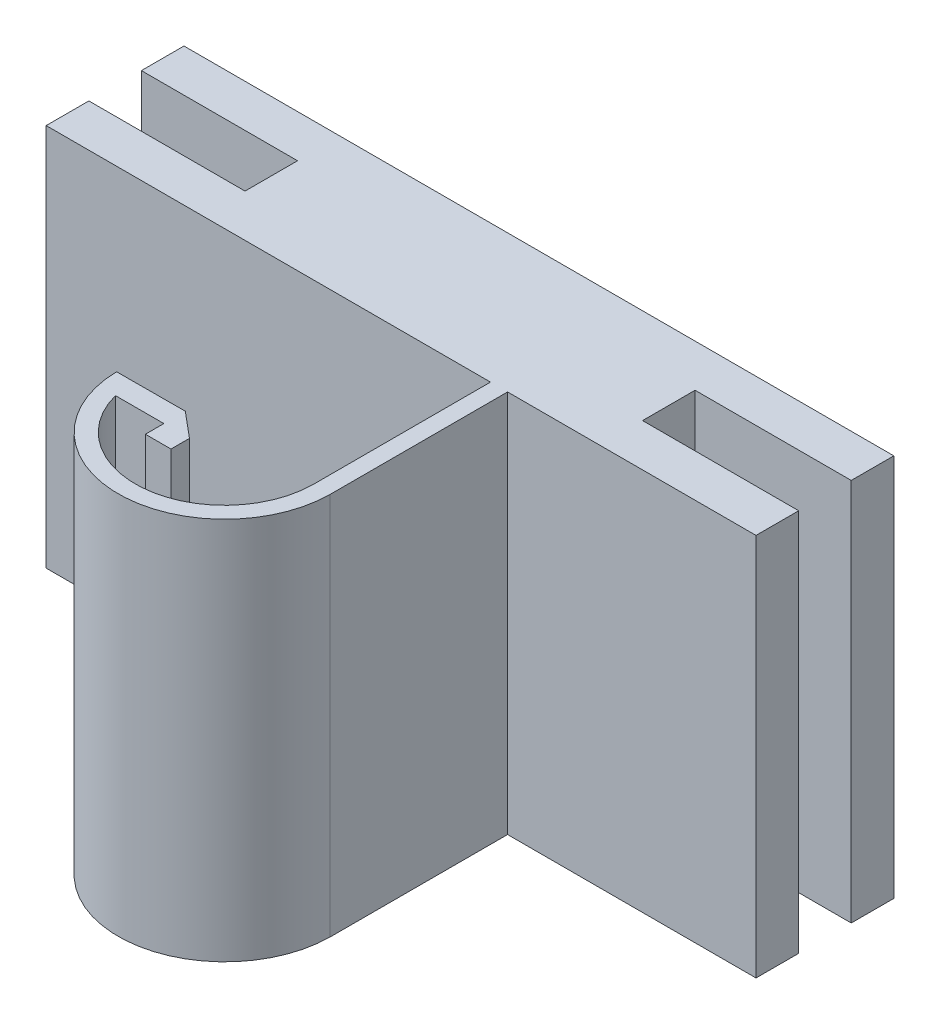
ISO-10303-21;
HEADER;
FILE_DESCRIPTION(('STEP AP214'),'2;1');
FILE_NAME('part.step','',(''),(''),'','','');
FILE_SCHEMA(('AUTOMOTIVE_DESIGN { 1 0 10303 214 1 1 1 1 }'));
ENDSEC;
DATA;
#1=APPLICATION_CONTEXT('core data for automotive mechanical design processes');
#2=APPLICATION_PROTOCOL_DEFINITION('international standard','automotive_design',2000,#1);
#3=PRODUCT_CONTEXT('',#1,'mechanical');
#4=PRODUCT('Part','Part','',(#3));
#5=PRODUCT_RELATED_PRODUCT_CATEGORY('part','',(#4));
#6=PRODUCT_DEFINITION_FORMATION('','',#4);
#7=PRODUCT_DEFINITION_CONTEXT('part definition',#1,'design');
#8=PRODUCT_DEFINITION('design','',#6,#7);
#9=PRODUCT_DEFINITION_SHAPE('','',#8);
#10=(LENGTH_UNIT() NAMED_UNIT(*) SI_UNIT(.MILLI.,.METRE.));
#11=(NAMED_UNIT(*) PLANE_ANGLE_UNIT() SI_UNIT($,.RADIAN.));
#12=(NAMED_UNIT(*) SI_UNIT($,.STERADIAN.) SOLID_ANGLE_UNIT());
#13=UNCERTAINTY_MEASURE_WITH_UNIT(LENGTH_MEASURE(1.E-05),#10,'distance_accuracy_value','');
#14=(GEOMETRIC_REPRESENTATION_CONTEXT(3) GLOBAL_UNCERTAINTY_ASSIGNED_CONTEXT((#13)) GLOBAL_UNIT_ASSIGNED_CONTEXT((#10,
#11,#12)) REPRESENTATION_CONTEXT('',''));
#15=CARTESIAN_POINT('',(0.,0.,0.));
#16=DIRECTION('',(0.,0.,1.));
#17=DIRECTION('',(1.,0.,0.));
#18=AXIS2_PLACEMENT_3D('',#15,#16,#17);
#19=CARTESIAN_POINT('',(-28.3494946045054,27.,-28.6641366865449));
#20=DIRECTION('',(1.,0.,0.));
#21=DIRECTION('',(0.,0.,-1.));
#22=AXIS2_PLACEMENT_3D('',#19,#20,#21);
#23=PLANE('',#22);
#24=DIRECTION('',(0.,0.,1.));
#25=VECTOR('',#24,1.);
#26=CARTESIAN_POINT('',(-28.3494946045054,0.,-28.6641366865449));
#27=LINE('',#26,#25);
#28=CARTESIAN_POINT('',(-28.3494946045054,0.,-28.6641366865449));
#29=VERTEX_POINT('',#28);
#30=CARTESIAN_POINT('',(-28.3494946045054,0.,-25.6641366865449));
#31=VERTEX_POINT('',#30);
#32=EDGE_CURVE('E219',#29,#31,#27,.T.);
#33=ORIENTED_EDGE('',*,*,#32,.T.);
#34=DIRECTION('',(0.,-1.,0.));
#35=VECTOR('',#34,1.);
#36=CARTESIAN_POINT('',(-28.3494946045054,27.,-25.6641366865449));
#37=LINE('',#36,#35);
#38=CARTESIAN_POINT('',(-28.3494946045054,27.,-25.6641366865449));
#39=VERTEX_POINT('',#38);
#40=EDGE_CURVE('E11',#39,#31,#37,.T.);
#41=ORIENTED_EDGE('',*,*,#40,.F.);
#42=DIRECTION('',(0.,0.,1.));
#43=VECTOR('',#42,1.);
#44=CARTESIAN_POINT('',(-28.3494946045054,27.,-28.6641366865449));
#45=LINE('',#44,#43);
#46=CARTESIAN_POINT('',(-28.3494946045054,27.,-28.6641366865449));
#47=VERTEX_POINT('',#46);
#48=EDGE_CURVE('E263',#47,#39,#45,.T.);
#49=ORIENTED_EDGE('',*,*,#48,.F.);
#50=DIRECTION('',(0.,-1.,0.));
#51=VECTOR('',#50,1.);
#52=CARTESIAN_POINT('',(-28.3494946045054,27.,-28.6641366865449));
#53=LINE('',#52,#51);
#54=EDGE_CURVE('E215',#47,#29,#53,.T.);
#55=ORIENTED_EDGE('',*,*,#54,.T.);
#56=EDGE_LOOP('',(#33,#41,#49,#55));
#57=FACE_BOUND('',#56,.T.);
#58=ADVANCED_FACE('F33',(#57),#23,.F.);
#59=CARTESIAN_POINT('',(-28.3494946045054,27.,-25.6641366865449));
#60=DIRECTION('',(0.,0.,-1.));
#61=DIRECTION('',(-1.,0.,0.));
#62=AXIS2_PLACEMENT_3D('',#59,#60,#61);
#63=PLANE('',#62);
#64=DIRECTION('',(1.,0.,0.));
#65=VECTOR('',#64,1.);
#66=CARTESIAN_POINT('',(-28.3494946045054,0.,-25.6641366865449));
#67=LINE('',#66,#65);
#68=CARTESIAN_POINT('',(-17.3494946045054,0.,-25.6641366865449));
#69=VERTEX_POINT('',#68);
#70=EDGE_CURVE('E222',#31,#69,#67,.T.);
#71=ORIENTED_EDGE('',*,*,#70,.T.);
#72=DIRECTION('',(0.,-1.,0.));
#73=VECTOR('',#72,1.);
#74=CARTESIAN_POINT('',(-17.3494946045054,27.,-25.6641366865449));
#75=LINE('',#74,#73);
#76=CARTESIAN_POINT('',(-17.3494946045054,27.,-25.6641366865449));
#77=VERTEX_POINT('',#76);
#78=EDGE_CURVE('E41',#77,#69,#75,.T.);
#79=ORIENTED_EDGE('',*,*,#78,.F.);
#80=DIRECTION('',(1.,0.,0.));
#81=VECTOR('',#80,1.);
#82=CARTESIAN_POINT('',(-28.3494946045054,27.,-25.6641366865449));
#83=LINE('',#82,#81);
#84=EDGE_CURVE('E137',#39,#77,#83,.T.);
#85=ORIENTED_EDGE('',*,*,#84,.F.);
#86=ORIENTED_EDGE('',*,*,#40,.T.);
#87=EDGE_LOOP('',(#71,#79,#85,#86));
#88=FACE_BOUND('',#87,.T.);
#89=ADVANCED_FACE('F396',(#88),#63,.F.);
#90=CARTESIAN_POINT('',(-17.3494946045054,27.,-25.6641366865449));
#91=DIRECTION('',(1.,0.,0.));
#92=DIRECTION('',(0.,0.,-1.));
#93=AXIS2_PLACEMENT_3D('',#90,#91,#92);
#94=PLANE('',#93);
#95=DIRECTION('',(0.,0.,1.));
#96=VECTOR('',#95,1.);
#97=CARTESIAN_POINT('',(-17.3494946045054,0.,-25.6641366865449));
#98=LINE('',#97,#96);
#99=CARTESIAN_POINT('',(-17.3494946045054,0.,-21.9641366865449));
#100=VERTEX_POINT('',#99);
#101=EDGE_CURVE('E224',#69,#100,#98,.T.);
#102=ORIENTED_EDGE('',*,*,#101,.T.);
#103=DIRECTION('',(0.,-1.,0.));
#104=VECTOR('',#103,1.);
#105=CARTESIAN_POINT('',(-17.3494946045054,27.,-21.9641366865449));
#106=LINE('',#105,#104);
#107=CARTESIAN_POINT('',(-17.3494946045054,27.,-21.9641366865449));
#108=VERTEX_POINT('',#107);
#109=EDGE_CURVE('E315',#108,#100,#106,.T.);
#110=ORIENTED_EDGE('',*,*,#109,.F.);
#111=DIRECTION('',(0.,0.,1.));
#112=VECTOR('',#111,1.);
#113=CARTESIAN_POINT('',(-17.3494946045054,27.,-25.6641366865449));
#114=LINE('',#113,#112);
#115=EDGE_CURVE('E323',#77,#108,#114,.T.);
#116=ORIENTED_EDGE('',*,*,#115,.F.);
#117=ORIENTED_EDGE('',*,*,#78,.T.);
#118=EDGE_LOOP('',(#102,#110,#116,#117));
#119=FACE_BOUND('',#118,.T.);
#120=ADVANCED_FACE('F321',(#119),#94,.F.);
#121=CARTESIAN_POINT('',(-28.3494946045054,27.,-21.9641366865449));
#122=DIRECTION('',(0.,0.,1.));
#123=DIRECTION('',(1.,0.,0.));
#124=AXIS2_PLACEMENT_3D('',#121,#122,#123);
#125=PLANE('',#124);
#126=DIRECTION('',(-1.,0.,0.));
#127=VECTOR('',#126,1.);
#128=CARTESIAN_POINT('',(-28.3494946045054,0.,-21.9641366865449));
#129=LINE('',#128,#127);
#130=CARTESIAN_POINT('',(-28.3494946045054,0.,-21.9641366865449));
#131=VERTEX_POINT('',#130);
#132=EDGE_CURVE('E226',#100,#131,#129,.T.);
#133=ORIENTED_EDGE('',*,*,#132,.T.);
#134=DIRECTION('',(0.,-1.,0.));
#135=VECTOR('',#134,1.);
#136=CARTESIAN_POINT('',(-28.3494946045054,27.,-21.9641366865449));
#137=LINE('',#136,#135);
#138=CARTESIAN_POINT('',(-28.3494946045054,27.,-21.9641366865449));
#139=VERTEX_POINT('',#138);
#140=EDGE_CURVE('E312',#139,#131,#137,.T.);
#141=ORIENTED_EDGE('',*,*,#140,.F.);
#142=DIRECTION('',(-1.,0.,0.));
#143=VECTOR('',#142,1.);
#144=CARTESIAN_POINT('',(-28.3494946045054,27.,-21.9641366865449));
#145=LINE('',#144,#143);
#146=EDGE_CURVE('E341',#108,#139,#145,.T.);
#147=ORIENTED_EDGE('',*,*,#146,.F.);
#148=ORIENTED_EDGE('',*,*,#109,.T.);
#149=EDGE_LOOP('',(#133,#141,#147,#148));
#150=FACE_BOUND('',#149,.T.);
#151=ADVANCED_FACE('F332',(#150),#125,.F.);
#152=CARTESIAN_POINT('',(-28.3494946045054,27.,-21.9641366865449));
#153=DIRECTION('',(1.,0.,0.));
#154=DIRECTION('',(0.,0.,-1.));
#155=AXIS2_PLACEMENT_3D('',#152,#153,#154);
#156=PLANE('',#155);
#157=DIRECTION('',(0.,0.,1.));
#158=VECTOR('',#157,1.);
#159=CARTESIAN_POINT('',(-28.3494946045054,0.,-21.9641366865449));
#160=LINE('',#159,#158);
#161=CARTESIAN_POINT('',(-28.3494946045054,0.,-18.957031621231));
#162=VERTEX_POINT('',#161);
#163=EDGE_CURVE('E228',#131,#162,#160,.T.);
#164=ORIENTED_EDGE('',*,*,#163,.T.);
#165=DIRECTION('',(0.,-1.,0.));
#166=VECTOR('',#165,1.);
#167=CARTESIAN_POINT('',(-28.3494946045054,27.,-18.957031621231));
#168=LINE('',#167,#166);
#169=CARTESIAN_POINT('',(-28.3494946045054,27.,-18.957031621231));
#170=VERTEX_POINT('',#169);
#171=EDGE_CURVE('E309',#170,#162,#168,.T.);
#172=ORIENTED_EDGE('',*,*,#171,.F.);
#173=DIRECTION('',(0.,0.,1.));
#174=VECTOR('',#173,1.);
#175=CARTESIAN_POINT('',(-28.3494946045054,27.,-21.9641366865449));
#176=LINE('',#175,#174);
#177=EDGE_CURVE('E338',#139,#170,#176,.T.);
#178=ORIENTED_EDGE('',*,*,#177,.F.);
#179=ORIENTED_EDGE('',*,*,#140,.T.);
#180=EDGE_LOOP('',(#164,#172,#178,#179));
#181=FACE_BOUND('',#180,.T.);
#182=ADVANCED_FACE('F336',(#181),#156,.F.);
#183=CARTESIAN_POINT('',(-28.3494946045054,27.,-18.957031621231));
#184=DIRECTION('',(0.,0.,-1.));
#185=DIRECTION('',(-1.,0.,0.));
#186=AXIS2_PLACEMENT_3D('',#183,#184,#185);
#187=PLANE('',#186);
#188=DIRECTION('',(1.,0.,0.));
#189=VECTOR('',#188,1.);
#190=CARTESIAN_POINT('',(-28.3494946045054,0.,-18.957031621231));
#191=LINE('',#190,#189);
#192=CARTESIAN_POINT('',(2.94781302884944,0.,-18.957031621231));
#193=VERTEX_POINT('',#192);
#194=EDGE_CURVE('E230',#162,#193,#191,.T.);
#195=ORIENTED_EDGE('',*,*,#194,.T.);
#196=DIRECTION('',(0.,-1.,0.));
#197=VECTOR('',#196,1.);
#198=CARTESIAN_POINT('',(2.94781302884944,27.,-18.957031621231));
#199=LINE('',#198,#197);
#200=CARTESIAN_POINT('',(2.94781302884944,27.,-18.957031621231));
#201=VERTEX_POINT('',#200);
#202=EDGE_CURVE('E306',#201,#193,#199,.T.);
#203=ORIENTED_EDGE('',*,*,#202,.F.);
#204=DIRECTION('',(1.,0.,0.));
#205=VECTOR('',#204,1.);
#206=CARTESIAN_POINT('',(-28.3494946045054,27.,-18.957031621231));
#207=LINE('',#206,#205);
#208=EDGE_CURVE('E340',#170,#201,#207,.T.);
#209=ORIENTED_EDGE('',*,*,#208,.F.);
#210=ORIENTED_EDGE('',*,*,#171,.T.);
#211=EDGE_LOOP('',(#195,#203,#209,#210));
#212=FACE_BOUND('',#211,.T.);
#213=ADVANCED_FACE('F409',(#212),#187,.F.);
#214=CARTESIAN_POINT('',(2.94781302884944,27.,-6.44073955662851));
#215=DIRECTION('',(1.,0.,0.));
#216=DIRECTION('',(0.,0.,-1.));
#217=AXIS2_PLACEMENT_3D('',#214,#215,#216);
#218=PLANE('',#217);
#219=DIRECTION('',(0.,0.,1.));
#220=VECTOR('',#219,1.);
#221=CARTESIAN_POINT('',(2.94781302884944,0.,-6.44073955662851));
#222=LINE('',#221,#220);
#223=CARTESIAN_POINT('',(2.94781302884944,0.,-6.44073955662851));
#224=VERTEX_POINT('',#223);
#225=EDGE_CURVE('E232',#193,#224,#222,.T.);
#226=ORIENTED_EDGE('',*,*,#225,.T.);
#227=DIRECTION('',(0.,-1.,0.));
#228=VECTOR('',#227,1.);
#229=CARTESIAN_POINT('',(2.94781302884944,27.,-6.44073955662851));
#230=LINE('',#229,#228);
#231=CARTESIAN_POINT('',(2.94781302884944,27.,-6.44073955662851));
#232=VERTEX_POINT('',#231);
#233=EDGE_CURVE('E303',#232,#224,#230,.T.);
#234=ORIENTED_EDGE('',*,*,#233,.F.);
#235=DIRECTION('',(0.,0.,1.));
#236=VECTOR('',#235,1.);
#237=CARTESIAN_POINT('',(2.94781302884944,27.,-6.44073955662851));
#238=LINE('',#237,#236);
#239=EDGE_CURVE('E343',#201,#232,#238,.T.);
#240=ORIENTED_EDGE('',*,*,#239,.F.);
#241=ORIENTED_EDGE('',*,*,#202,.T.);
#242=EDGE_LOOP('',(#226,#234,#240,#241));
#243=FACE_BOUND('',#242,.T.);
#244=ADVANCED_FACE('F412',(#243),#218,.F.);
#245=CARTESIAN_POINT('',(-3.34884776816842,27.,-6.52915678023728));
#246=DIRECTION('',(0.,-1.,0.));
#247=DIRECTION('',(0.,0.,-1.));
#248=AXIS2_PLACEMENT_3D('',#245,#246,#247);
#249=CYLINDRICAL_SURFACE('',#248,6.29728154032613);
#250=CARTESIAN_POINT('',(-3.34884776816842,0.,-6.52915678023728));
#251=DIRECTION('',(0.,-1.,0.));
#252=DIRECTION('',(0.,0.,1.));
#253=AXIS2_PLACEMENT_3D('',#250,#251,#252);
#254=CIRCLE('',#253,6.29728154032613);
#255=CARTESIAN_POINT('',(-9.43791517748593,0.,-4.9232262453387));
#256=VERTEX_POINT('',#255);
#257=EDGE_CURVE('E234',#224,#256,#254,.T.);
#258=ORIENTED_EDGE('',*,*,#257,.T.);
#259=DIRECTION('',(0.,-1.,0.));
#260=VECTOR('',#259,1.);
#261=CARTESIAN_POINT('',(-9.43791517748593,27.,-4.9232262453387));
#262=LINE('',#261,#260);
#263=CARTESIAN_POINT('',(-9.43791517748593,27.,-4.9232262453387));
#264=VERTEX_POINT('',#263);
#265=EDGE_CURVE('E300',#264,#256,#262,.T.);
#266=ORIENTED_EDGE('',*,*,#265,.F.);
#267=CARTESIAN_POINT('',(-3.34884776816842,27.,-6.52915678023728));
#268=DIRECTION('',(0.,-1.,0.));
#269=DIRECTION('',(0.,0.,1.));
#270=AXIS2_PLACEMENT_3D('',#267,#268,#269);
#271=CIRCLE('',#270,6.29728154032613);
#272=EDGE_CURVE('E349',#232,#264,#271,.T.);
#273=ORIENTED_EDGE('',*,*,#272,.F.);
#274=ORIENTED_EDGE('',*,*,#233,.T.);
#275=EDGE_LOOP('',(#258,#266,#273,#274));
#276=FACE_BOUND('',#275,.T.);
#277=ADVANCED_FACE('F416',(#276),#249,.F.);
#278=CARTESIAN_POINT('',(-6.02618083831885,27.,-4.9232262453387));
#279=DIRECTION('',(0.,0.,-1.));
#280=DIRECTION('',(-1.,0.,0.));
#281=AXIS2_PLACEMENT_3D('',#278,#279,#280);
#282=PLANE('',#281);
#283=DIRECTION('',(1.,0.,0.));
#284=VECTOR('',#283,1.);
#285=CARTESIAN_POINT('',(-6.02618083831885,0.,-4.9232262453387));
#286=LINE('',#285,#284);
#287=CARTESIAN_POINT('',(-6.02618083831885,0.,-4.9232262453387));
#288=VERTEX_POINT('',#287);
#289=EDGE_CURVE('E236',#256,#288,#286,.T.);
#290=ORIENTED_EDGE('',*,*,#289,.T.);
#291=DIRECTION('',(0.,-1.,0.));
#292=VECTOR('',#291,1.);
#293=CARTESIAN_POINT('',(-6.02618083831885,27.,-4.9232262453387));
#294=LINE('',#293,#292);
#295=CARTESIAN_POINT('',(-6.02618083831885,27.,-4.9232262453387));
#296=VERTEX_POINT('',#295);
#297=EDGE_CURVE('E297',#296,#288,#294,.T.);
#298=ORIENTED_EDGE('',*,*,#297,.F.);
#299=DIRECTION('',(1.,0.,0.));
#300=VECTOR('',#299,1.);
#301=CARTESIAN_POINT('',(-6.02618083831885,27.,-4.9232262453387));
#302=LINE('',#301,#300);
#303=EDGE_CURVE('E351',#264,#296,#302,.T.);
#304=ORIENTED_EDGE('',*,*,#303,.F.);
#305=ORIENTED_EDGE('',*,*,#265,.T.);
#306=EDGE_LOOP('',(#290,#298,#304,#305));
#307=FACE_BOUND('',#306,.T.);
#308=ADVANCED_FACE('F420',(#307),#282,.F.);
#309=CARTESIAN_POINT('',(-6.02618083831885,27.,-3.62215741536431));
#310=DIRECTION('',(1.,0.,0.));
#311=DIRECTION('',(0.,0.,-1.));
#312=AXIS2_PLACEMENT_3D('',#309,#310,#311);
#313=PLANE('',#312);
#314=DIRECTION('',(0.,0.,1.));
#315=VECTOR('',#314,1.);
#316=CARTESIAN_POINT('',(-6.02618083831885,0.,-3.62215741536431));
#317=LINE('',#316,#315);
#318=CARTESIAN_POINT('',(-6.02618083831885,0.,-3.62215741536431));
#319=VERTEX_POINT('',#318);
#320=EDGE_CURVE('E238',#288,#319,#317,.T.);
#321=ORIENTED_EDGE('',*,*,#320,.T.);
#322=DIRECTION('',(0.,-1.,0.));
#323=VECTOR('',#322,1.);
#324=CARTESIAN_POINT('',(-6.02618083831885,27.,-3.62215741536431));
#325=LINE('',#324,#323);
#326=CARTESIAN_POINT('',(-6.02618083831885,27.,-3.62215741536431));
#327=VERTEX_POINT('',#326);
#328=EDGE_CURVE('E294',#327,#319,#325,.T.);
#329=ORIENTED_EDGE('',*,*,#328,.F.);
#330=DIRECTION('',(0.,0.,1.));
#331=VECTOR('',#330,1.);
#332=CARTESIAN_POINT('',(-6.02618083831885,27.,-3.62215741536431));
#333=LINE('',#332,#331);
#334=EDGE_CURVE('E353',#296,#327,#333,.T.);
#335=ORIENTED_EDGE('',*,*,#334,.F.);
#336=ORIENTED_EDGE('',*,*,#297,.T.);
#337=EDGE_LOOP('',(#321,#329,#335,#336));
#338=FACE_BOUND('',#337,.T.);
#339=ADVANCED_FACE('F424',(#338),#313,.F.);
#340=CARTESIAN_POINT('',(-4.22249353495374,27.,-3.62215741536431));
#341=DIRECTION('',(0.,0.,-1.));
#342=DIRECTION('',(-1.,0.,0.));
#343=AXIS2_PLACEMENT_3D('',#340,#341,#342);
#344=PLANE('',#343);
#345=DIRECTION('',(1.,0.,0.));
#346=VECTOR('',#345,1.);
#347=CARTESIAN_POINT('',(-4.22249353495374,0.,-3.62215741536431));
#348=LINE('',#347,#346);
#349=CARTESIAN_POINT('',(-4.22249353495374,0.,-3.62215741536431));
#350=VERTEX_POINT('',#349);
#351=EDGE_CURVE('E240',#319,#350,#348,.T.);
#352=ORIENTED_EDGE('',*,*,#351,.T.);
#353=DIRECTION('',(0.,-1.,0.));
#354=VECTOR('',#353,1.);
#355=CARTESIAN_POINT('',(-4.22249353495374,27.,-3.62215741536431));
#356=LINE('',#355,#354);
#357=CARTESIAN_POINT('',(-4.22249353495374,27.,-3.62215741536431));
#358=VERTEX_POINT('',#357);
#359=EDGE_CURVE('E291',#358,#350,#356,.T.);
#360=ORIENTED_EDGE('',*,*,#359,.F.);
#361=DIRECTION('',(1.,0.,0.));
#362=VECTOR('',#361,1.);
#363=CARTESIAN_POINT('',(-4.22249353495374,27.,-3.62215741536431));
#364=LINE('',#363,#362);
#365=EDGE_CURVE('E355',#327,#358,#364,.T.);
#366=ORIENTED_EDGE('',*,*,#365,.F.);
#367=ORIENTED_EDGE('',*,*,#328,.T.);
#368=EDGE_LOOP('',(#352,#360,#366,#367));
#369=FACE_BOUND('',#368,.T.);
#370=ADVANCED_FACE('F428',(#369),#344,.F.);
#371=CARTESIAN_POINT('',(-4.22249353495374,27.,-4.9232262453387));
#372=DIRECTION('',(-1.,0.,0.));
#373=DIRECTION('',(0.,0.,1.));
#374=AXIS2_PLACEMENT_3D('',#371,#372,#373);
#375=PLANE('',#374);
#376=DIRECTION('',(0.,0.,-1.));
#377=VECTOR('',#376,1.);
#378=CARTESIAN_POINT('',(-4.22249353495374,0.,-4.9232262453387));
#379=LINE('',#378,#377);
#380=CARTESIAN_POINT('',(-4.22249353495374,0.,-4.9232262453387));
#381=VERTEX_POINT('',#380);
#382=EDGE_CURVE('E242',#350,#381,#379,.T.);
#383=ORIENTED_EDGE('',*,*,#382,.T.);
#384=DIRECTION('',(0.,-1.,0.));
#385=VECTOR('',#384,1.);
#386=CARTESIAN_POINT('',(-4.22249353495374,27.,-4.9232262453387));
#387=LINE('',#386,#385);
#388=CARTESIAN_POINT('',(-4.22249353495374,27.,-4.9232262453387));
#389=VERTEX_POINT('',#388);
#390=EDGE_CURVE('E288',#389,#381,#387,.T.);
#391=ORIENTED_EDGE('',*,*,#390,.F.);
#392=DIRECTION('',(0.,0.,-1.));
#393=VECTOR('',#392,1.);
#394=CARTESIAN_POINT('',(-4.22249353495374,27.,-4.9232262453387));
#395=LINE('',#394,#393);
#396=EDGE_CURVE('E357',#358,#389,#395,.T.);
#397=ORIENTED_EDGE('',*,*,#396,.F.);
#398=ORIENTED_EDGE('',*,*,#359,.T.);
#399=EDGE_LOOP('',(#383,#391,#397,#398));
#400=FACE_BOUND('',#399,.T.);
#401=ADVANCED_FACE('F432',(#400),#375,.F.);
#402=CARTESIAN_POINT('',(-6.02618083831885,27.,-6.43238928070324));
#403=DIRECTION('',(-0.641711450833544,0.,0.766946160997699));
#404=DIRECTION('',(0.766946160997698,0.,0.641711450833544));
#405=AXIS2_PLACEMENT_3D('',#402,#403,#404);
#406=PLANE('',#405);
#407=DIRECTION('',(-0.766946160997698,0.,-0.641711450833544));
#408=VECTOR('',#407,1.);
#409=CARTESIAN_POINT('',(-6.02618083831885,0.,-6.43238928070324));
#410=LINE('',#409,#408);
#411=CARTESIAN_POINT('',(-6.02618083831885,0.,-6.43238928070324));
#412=VERTEX_POINT('',#411);
#413=EDGE_CURVE('E244',#381,#412,#410,.T.);
#414=ORIENTED_EDGE('',*,*,#413,.T.);
#415=DIRECTION('',(0.,-1.,0.));
#416=VECTOR('',#415,1.);
#417=CARTESIAN_POINT('',(-6.02618083831885,27.,-6.43238928070324));
#418=LINE('',#417,#416);
#419=CARTESIAN_POINT('',(-6.02618083831885,27.,-6.43238928070324));
#420=VERTEX_POINT('',#419);
#421=EDGE_CURVE('E285',#420,#412,#418,.T.);
#422=ORIENTED_EDGE('',*,*,#421,.F.);
#423=DIRECTION('',(-0.766946160997698,0.,-0.641711450833544));
#424=VECTOR('',#423,1.);
#425=CARTESIAN_POINT('',(-6.02618083831885,27.,-6.43238928070324));
#426=LINE('',#425,#424);
#427=EDGE_CURVE('E359',#389,#420,#426,.T.);
#428=ORIENTED_EDGE('',*,*,#427,.F.);
#429=ORIENTED_EDGE('',*,*,#390,.T.);
#430=EDGE_LOOP('',(#414,#422,#428,#429));
#431=FACE_BOUND('',#430,.T.);
#432=ADVANCED_FACE('F436',(#431),#406,.F.);
#433=CARTESIAN_POINT('',(-10.8477142626421,27.,-6.41734797036781));
#434=DIRECTION('',(0.0031195961577817,0.,0.999995134048068));
#435=DIRECTION('',(0.999995134048068,0.,-0.0031195961577817));
#436=AXIS2_PLACEMENT_3D('',#433,#434,#435);
#437=PLANE('',#436);
#438=DIRECTION('',(-0.999995134048067,0.,0.0031195961577817));
#439=VECTOR('',#438,1.);
#440=CARTESIAN_POINT('',(-10.8477142626421,0.,-6.41734797036781));
#441=LINE('',#440,#439);
#442=CARTESIAN_POINT('',(-10.8477142626421,0.,-6.41734797036781));
#443=VERTEX_POINT('',#442);
#444=EDGE_CURVE('E246',#412,#443,#441,.T.);
#445=ORIENTED_EDGE('',*,*,#444,.T.);
#446=DIRECTION('',(0.,-1.,0.));
#447=VECTOR('',#446,1.);
#448=CARTESIAN_POINT('',(-10.8477142626421,27.,-6.41734797036781));
#449=LINE('',#448,#447);
#450=CARTESIAN_POINT('',(-10.8477142626421,27.,-6.41734797036781));
#451=VERTEX_POINT('',#450);
#452=EDGE_CURVE('E282',#451,#443,#449,.T.);
#453=ORIENTED_EDGE('',*,*,#452,.F.);
#454=DIRECTION('',(-0.999995134048067,0.,0.0031195961577817));
#455=VECTOR('',#454,1.);
#456=CARTESIAN_POINT('',(-10.8477142626421,27.,-6.41734797036781));
#457=LINE('',#456,#455);
#458=EDGE_CURVE('E361',#420,#451,#457,.T.);
#459=ORIENTED_EDGE('',*,*,#458,.F.);
#460=ORIENTED_EDGE('',*,*,#421,.T.);
#461=EDGE_LOOP('',(#445,#453,#459,#460));
#462=FACE_BOUND('',#461,.T.);
#463=ADVANCED_FACE('F440',(#462),#437,.F.);
#464=CARTESIAN_POINT('',(-3.34884776816842,27.,-6.52915678023728));
#465=DIRECTION('',(0.,-1.,0.));
#466=DIRECTION('',(0.,0.,-1.));
#467=AXIS2_PLACEMENT_3D('',#464,#465,#466);
#468=CYLINDRICAL_SURFACE('',#467,7.49969998812645);
#469=CARTESIAN_POINT('',(-3.34884776816842,0.,-6.52915678023728));
#470=DIRECTION('',(0.,1.,0.));
#471=DIRECTION('',(0.,0.,1.));
#472=AXIS2_PLACEMENT_3D('',#469,#470,#471);
#473=CIRCLE('',#472,7.49969998812645);
#474=CARTESIAN_POINT('',(4.15050539549457,0.,-6.45703162123102));
#475=VERTEX_POINT('',#474);
#476=EDGE_CURVE('E248',#443,#475,#473,.T.);
#477=ORIENTED_EDGE('',*,*,#476,.T.);
#478=DIRECTION('',(0.,-1.,0.));
#479=VECTOR('',#478,1.);
#480=CARTESIAN_POINT('',(4.15050539549457,27.,-6.45703162123102));
#481=LINE('',#480,#479);
#482=CARTESIAN_POINT('',(4.15050539549457,27.,-6.45703162123102));
#483=VERTEX_POINT('',#482);
#484=EDGE_CURVE('E279',#483,#475,#481,.T.);
#485=ORIENTED_EDGE('',*,*,#484,.F.);
#486=CARTESIAN_POINT('',(-3.34884776816842,27.,-6.52915678023728));
#487=DIRECTION('',(0.,1.,0.));
#488=DIRECTION('',(0.,0.,1.));
#489=AXIS2_PLACEMENT_3D('',#486,#487,#488);
#490=CIRCLE('',#489,7.49969998812645);
#491=EDGE_CURVE('E363',#451,#483,#490,.T.);
#492=ORIENTED_EDGE('',*,*,#491,.F.);
#493=ORIENTED_EDGE('',*,*,#452,.T.);
#494=EDGE_LOOP('',(#477,#485,#492,#493));
#495=FACE_BOUND('',#494,.T.);
#496=ADVANCED_FACE('F444',(#495),#468,.T.);
#497=CARTESIAN_POINT('',(4.15050539549457,27.,-18.957031621231));
#498=DIRECTION('',(-1.,0.,0.));
#499=DIRECTION('',(0.,0.,1.));
#500=AXIS2_PLACEMENT_3D('',#497,#498,#499);
#501=PLANE('',#500);
#502=DIRECTION('',(0.,0.,-1.));
#503=VECTOR('',#502,1.);
#504=CARTESIAN_POINT('',(4.15050539549457,0.,-18.957031621231));
#505=LINE('',#504,#503);
#506=CARTESIAN_POINT('',(4.15050539549457,0.,-18.957031621231));
#507=VERTEX_POINT('',#506);
#508=EDGE_CURVE('E250',#475,#507,#505,.T.);
#509=ORIENTED_EDGE('',*,*,#508,.T.);
#510=DIRECTION('',(0.,-1.,0.));
#511=VECTOR('',#510,1.);
#512=CARTESIAN_POINT('',(4.15050539549457,27.,-18.957031621231));
#513=LINE('',#512,#511);
#514=CARTESIAN_POINT('',(4.15050539549457,27.,-18.957031621231));
#515=VERTEX_POINT('',#514);
#516=EDGE_CURVE('E276',#515,#507,#513,.T.);
#517=ORIENTED_EDGE('',*,*,#516,.F.);
#518=DIRECTION('',(0.,0.,-1.));
#519=VECTOR('',#518,1.);
#520=CARTESIAN_POINT('',(4.15050539549457,27.,-18.957031621231));
#521=LINE('',#520,#519);
#522=EDGE_CURVE('E365',#483,#515,#521,.T.);
#523=ORIENTED_EDGE('',*,*,#522,.F.);
#524=ORIENTED_EDGE('',*,*,#484,.T.);
#525=EDGE_LOOP('',(#509,#517,#523,#524));
#526=FACE_BOUND('',#525,.T.);
#527=ADVANCED_FACE('F448',(#526),#501,.F.);
#528=CARTESIAN_POINT('',(4.15050539549457,27.,-18.957031621231));
#529=DIRECTION('',(0.,0.,-1.));
#530=DIRECTION('',(-1.,0.,0.));
#531=AXIS2_PLACEMENT_3D('',#528,#529,#530);
#532=PLANE('',#531);
#533=DIRECTION('',(1.,0.,0.));
#534=VECTOR('',#533,1.);
#535=CARTESIAN_POINT('',(4.15050539549457,0.,-18.957031621231));
#536=LINE('',#535,#534);
#537=CARTESIAN_POINT('',(21.6505053954946,0.,-18.957031621231));
#538=VERTEX_POINT('',#537);
#539=EDGE_CURVE('E252',#507,#538,#536,.T.);
#540=ORIENTED_EDGE('',*,*,#539,.T.);
#541=DIRECTION('',(0.,-1.,0.));
#542=VECTOR('',#541,1.);
#543=CARTESIAN_POINT('',(21.6505053954946,27.,-18.957031621231));
#544=LINE('',#543,#542);
#545=CARTESIAN_POINT('',(21.6505053954946,27.,-18.957031621231));
#546=VERTEX_POINT('',#545);
#547=EDGE_CURVE('E273',#546,#538,#544,.T.);
#548=ORIENTED_EDGE('',*,*,#547,.F.);
#549=DIRECTION('',(1.,0.,0.));
#550=VECTOR('',#549,1.);
#551=CARTESIAN_POINT('',(4.15050539549457,27.,-18.957031621231));
#552=LINE('',#551,#550);
#553=EDGE_CURVE('E367',#515,#546,#552,.T.);
#554=ORIENTED_EDGE('',*,*,#553,.F.);
#555=ORIENTED_EDGE('',*,*,#516,.T.);
#556=EDGE_LOOP('',(#540,#548,#554,#555));
#557=FACE_BOUND('',#556,.T.);
#558=ADVANCED_FACE('F452',(#557),#532,.F.);
#559=CARTESIAN_POINT('',(21.6505053954946,27.,-21.9641366865449));
#560=DIRECTION('',(-1.,0.,0.));
#561=DIRECTION('',(0.,0.,1.));
#562=AXIS2_PLACEMENT_3D('',#559,#560,#561);
#563=PLANE('',#562);
#564=DIRECTION('',(0.,0.,-1.));
#565=VECTOR('',#564,1.);
#566=CARTESIAN_POINT('',(21.6505053954946,0.,-21.9641366865449));
#567=LINE('',#566,#565);
#568=CARTESIAN_POINT('',(21.6505053954946,0.,-21.9641366865449));
#569=VERTEX_POINT('',#568);
#570=EDGE_CURVE('E254',#538,#569,#567,.T.);
#571=ORIENTED_EDGE('',*,*,#570,.T.);
#572=DIRECTION('',(0.,-1.,0.));
#573=VECTOR('',#572,1.);
#574=CARTESIAN_POINT('',(21.6505053954946,27.,-21.9641366865449));
#575=LINE('',#574,#573);
#576=CARTESIAN_POINT('',(21.6505053954946,27.,-21.9641366865449));
#577=VERTEX_POINT('',#576);
#578=EDGE_CURVE('E270',#577,#569,#575,.T.);
#579=ORIENTED_EDGE('',*,*,#578,.F.);
#580=DIRECTION('',(0.,0.,-1.));
#581=VECTOR('',#580,1.);
#582=CARTESIAN_POINT('',(21.6505053954946,27.,-21.9641366865449));
#583=LINE('',#582,#581);
#584=EDGE_CURVE('E369',#546,#577,#583,.T.);
#585=ORIENTED_EDGE('',*,*,#584,.F.);
#586=ORIENTED_EDGE('',*,*,#547,.T.);
#587=EDGE_LOOP('',(#571,#579,#585,#586));
#588=FACE_BOUND('',#587,.T.);
#589=ADVANCED_FACE('F456',(#588),#563,.F.);
#590=CARTESIAN_POINT('',(10.6505053954946,27.,-21.9641366865449));
#591=DIRECTION('',(0.,0.,1.));
#592=DIRECTION('',(1.,0.,0.));
#593=AXIS2_PLACEMENT_3D('',#590,#591,#592);
#594=PLANE('',#593);
#595=DIRECTION('',(-1.,0.,0.));
#596=VECTOR('',#595,1.);
#597=CARTESIAN_POINT('',(10.6505053954946,0.,-21.9641366865449));
#598=LINE('',#597,#596);
#599=CARTESIAN_POINT('',(10.6505053954946,0.,-21.9641366865449));
#600=VERTEX_POINT('',#599);
#601=EDGE_CURVE('E256',#569,#600,#598,.T.);
#602=ORIENTED_EDGE('',*,*,#601,.T.);
#603=DIRECTION('',(0.,-1.,0.));
#604=VECTOR('',#603,1.);
#605=CARTESIAN_POINT('',(10.6505053954946,27.,-21.9641366865449));
#606=LINE('',#605,#604);
#607=CARTESIAN_POINT('',(10.6505053954946,27.,-21.9641366865449));
#608=VERTEX_POINT('',#607);
#609=EDGE_CURVE('E267',#608,#600,#606,.T.);
#610=ORIENTED_EDGE('',*,*,#609,.F.);
#611=DIRECTION('',(-1.,0.,0.));
#612=VECTOR('',#611,1.);
#613=CARTESIAN_POINT('',(10.6505053954946,27.,-21.9641366865449));
#614=LINE('',#613,#612);
#615=EDGE_CURVE('E371',#577,#608,#614,.T.);
#616=ORIENTED_EDGE('',*,*,#615,.F.);
#617=ORIENTED_EDGE('',*,*,#578,.T.);
#618=EDGE_LOOP('',(#602,#610,#616,#617));
#619=FACE_BOUND('',#618,.T.);
#620=ADVANCED_FACE('F377',(#619),#594,.F.);
#621=CARTESIAN_POINT('',(10.6505053954946,27.,-25.6641366865449));
#622=DIRECTION('',(-1.,0.,0.));
#623=DIRECTION('',(0.,0.,1.));
#624=AXIS2_PLACEMENT_3D('',#621,#622,#623);
#625=PLANE('',#624);
#626=DIRECTION('',(0.,0.,-1.));
#627=VECTOR('',#626,1.);
#628=CARTESIAN_POINT('',(10.6505053954946,0.,-25.6641366865449));
#629=LINE('',#628,#627);
#630=CARTESIAN_POINT('',(10.6505053954946,0.,-25.6641366865449));
#631=VERTEX_POINT('',#630);
#632=EDGE_CURVE('E258',#600,#631,#629,.T.);
#633=ORIENTED_EDGE('',*,*,#632,.T.);
#634=DIRECTION('',(0.,-1.,0.));
#635=VECTOR('',#634,1.);
#636=CARTESIAN_POINT('',(10.6505053954946,27.,-25.6641366865449));
#637=LINE('',#636,#635);
#638=CARTESIAN_POINT('',(10.6505053954946,27.,-25.6641366865449));
#639=VERTEX_POINT('',#638);
#640=EDGE_CURVE('E210',#639,#631,#637,.T.);
#641=ORIENTED_EDGE('',*,*,#640,.F.);
#642=DIRECTION('',(0.,0.,-1.));
#643=VECTOR('',#642,1.);
#644=CARTESIAN_POINT('',(10.6505053954946,27.,-25.6641366865449));
#645=LINE('',#644,#643);
#646=EDGE_CURVE('E201',#608,#639,#645,.T.);
#647=ORIENTED_EDGE('',*,*,#646,.F.);
#648=ORIENTED_EDGE('',*,*,#609,.T.);
#649=EDGE_LOOP('',(#633,#641,#647,#648));
#650=FACE_BOUND('',#649,.T.);
#651=ADVANCED_FACE('F381',(#650),#625,.F.);
#652=CARTESIAN_POINT('',(10.6505053954946,27.,-25.6641366865449));
#653=DIRECTION('',(0.,0.,-1.));
#654=DIRECTION('',(-1.,0.,0.));
#655=AXIS2_PLACEMENT_3D('',#652,#653,#654);
#656=PLANE('',#655);
#657=DIRECTION('',(1.,0.,0.));
#658=VECTOR('',#657,1.);
#659=CARTESIAN_POINT('',(10.6505053954946,0.,-25.6641366865449));
#660=LINE('',#659,#658);
#661=CARTESIAN_POINT('',(21.6505053954946,0.,-25.6641366865449));
#662=VERTEX_POINT('',#661);
#663=EDGE_CURVE('E209',#631,#662,#660,.T.);
#664=ORIENTED_EDGE('',*,*,#663,.T.);
#665=DIRECTION('',(0.,-1.,0.));
#666=VECTOR('',#665,1.);
#667=CARTESIAN_POINT('',(21.6505053954946,27.,-25.6641366865449));
#668=LINE('',#667,#666);
#669=CARTESIAN_POINT('',(21.6505053954946,27.,-25.6641366865449));
#670=VERTEX_POINT('',#669);
#671=EDGE_CURVE('E206',#670,#662,#668,.T.);
#672=ORIENTED_EDGE('',*,*,#671,.F.);
#673=DIRECTION('',(1.,0.,0.));
#674=VECTOR('',#673,1.);
#675=CARTESIAN_POINT('',(10.6505053954946,27.,-25.6641366865449));
#676=LINE('',#675,#674);
#677=EDGE_CURVE('E195',#639,#670,#676,.T.);
#678=ORIENTED_EDGE('',*,*,#677,.F.);
#679=ORIENTED_EDGE('',*,*,#640,.T.);
#680=EDGE_LOOP('',(#664,#672,#678,#679));
#681=FACE_BOUND('',#680,.T.);
#682=ADVANCED_FACE('F207',(#681),#656,.F.);
#683=CARTESIAN_POINT('',(21.6505053954946,27.,-28.6641366865449));
#684=DIRECTION('',(-1.,0.,0.));
#685=DIRECTION('',(0.,0.,1.));
#686=AXIS2_PLACEMENT_3D('',#683,#684,#685);
#687=PLANE('',#686);
#688=DIRECTION('',(0.,0.,-1.));
#689=VECTOR('',#688,1.);
#690=CARTESIAN_POINT('',(21.6505053954946,0.,-28.6641366865449));
#691=LINE('',#690,#689);
#692=CARTESIAN_POINT('',(21.6505053954946,0.,-28.6641366865449));
#693=VERTEX_POINT('',#692);
#694=EDGE_CURVE('E123',#662,#693,#691,.T.);
#695=ORIENTED_EDGE('',*,*,#694,.T.);
#696=DIRECTION('',(0.,-1.,0.));
#697=VECTOR('',#696,1.);
#698=CARTESIAN_POINT('',(21.6505053954946,27.,-28.6641366865449));
#699=LINE('',#698,#697);
#700=CARTESIAN_POINT('',(21.6505053954946,27.,-28.6641366865449));
#701=VERTEX_POINT('',#700);
#702=EDGE_CURVE('E211',#701,#693,#699,.T.);
#703=ORIENTED_EDGE('',*,*,#702,.F.);
#704=DIRECTION('',(0.,0.,-1.));
#705=VECTOR('',#704,1.);
#706=CARTESIAN_POINT('',(21.6505053954946,27.,-28.6641366865449));
#707=LINE('',#706,#705);
#708=EDGE_CURVE('E199',#670,#701,#707,.T.);
#709=ORIENTED_EDGE('',*,*,#708,.F.);
#710=ORIENTED_EDGE('',*,*,#671,.T.);
#711=EDGE_LOOP('',(#695,#703,#709,#710));
#712=FACE_BOUND('',#711,.T.);
#713=ADVANCED_FACE('F213',(#712),#687,.F.);
#714=CARTESIAN_POINT('',(-28.3494946045054,27.,-28.6641366865449));
#715=DIRECTION('',(0.,0.,1.));
#716=DIRECTION('',(1.,0.,0.));
#717=AXIS2_PLACEMENT_3D('',#714,#715,#716);
#718=PLANE('',#717);
#719=DIRECTION('',(-1.,0.,0.));
#720=VECTOR('',#719,1.);
#721=CARTESIAN_POINT('',(-28.3494946045054,0.,-28.6641366865449));
#722=LINE('',#721,#720);
#723=EDGE_CURVE('E129',#693,#29,#722,.T.);
#724=ORIENTED_EDGE('',*,*,#723,.T.);
#725=ORIENTED_EDGE('',*,*,#54,.F.);
#726=DIRECTION('',(-1.,0.,0.));
#727=VECTOR('',#726,1.);
#728=CARTESIAN_POINT('',(-28.3494946045054,27.,-28.6641366865449));
#729=LINE('',#728,#727);
#730=EDGE_CURVE('E49',#701,#47,#729,.T.);
#731=ORIENTED_EDGE('',*,*,#730,.F.);
#732=ORIENTED_EDGE('',*,*,#702,.T.);
#733=EDGE_LOOP('',(#724,#725,#731,#732));
#734=FACE_BOUND('',#733,.T.);
#735=ADVANCED_FACE('F385',(#734),#718,.F.);
#736=CARTESIAN_POINT('',(-3.34884776816842,27.,-6.52915678023728));
#737=DIRECTION('',(0.,1.,0.));
#738=DIRECTION('',(0.,0.,1.));
#739=AXIS2_PLACEMENT_3D('',#736,#737,#738);
#740=PLANE('',#739);
#741=ORIENTED_EDGE('',*,*,#48,.T.);
#742=ORIENTED_EDGE('',*,*,#84,.T.);
#743=ORIENTED_EDGE('',*,*,#115,.T.);
#744=ORIENTED_EDGE('',*,*,#146,.T.);
#745=ORIENTED_EDGE('',*,*,#177,.T.);
#746=ORIENTED_EDGE('',*,*,#208,.T.);
#747=ORIENTED_EDGE('',*,*,#239,.T.);
#748=ORIENTED_EDGE('',*,*,#272,.T.);
#749=ORIENTED_EDGE('',*,*,#303,.T.);
#750=ORIENTED_EDGE('',*,*,#334,.T.);
#751=ORIENTED_EDGE('',*,*,#365,.T.);
#752=ORIENTED_EDGE('',*,*,#396,.T.);
#753=ORIENTED_EDGE('',*,*,#427,.T.);
#754=ORIENTED_EDGE('',*,*,#458,.T.);
#755=ORIENTED_EDGE('',*,*,#491,.T.);
#756=ORIENTED_EDGE('',*,*,#522,.T.);
#757=ORIENTED_EDGE('',*,*,#553,.T.);
#758=ORIENTED_EDGE('',*,*,#584,.T.);
#759=ORIENTED_EDGE('',*,*,#615,.T.);
#760=ORIENTED_EDGE('',*,*,#646,.T.);
#761=ORIENTED_EDGE('',*,*,#677,.T.);
#762=ORIENTED_EDGE('',*,*,#708,.T.);
#763=ORIENTED_EDGE('',*,*,#730,.T.);
#764=EDGE_LOOP('',(#741,#742,#743,#744,#745,#746,#747,#748,#749,#750,#751,#752,#753,#754,#755,
#756,#757,#758,#759,#760,#761,#762,#763));
#765=FACE_BOUND('',#764,.T.);
#766=ADVANCED_FACE('F197',(#765),#740,.T.);
#767=CARTESIAN_POINT('',(-3.34884776816842,0.,-6.52915678023728));
#768=DIRECTION('',(0.,1.,0.));
#769=DIRECTION('',(0.,0.,1.));
#770=AXIS2_PLACEMENT_3D('',#767,#768,#769);
#771=PLANE('',#770);
#772=ORIENTED_EDGE('',*,*,#32,.F.);
#773=ORIENTED_EDGE('',*,*,#723,.F.);
#774=ORIENTED_EDGE('',*,*,#694,.F.);
#775=ORIENTED_EDGE('',*,*,#663,.F.);
#776=ORIENTED_EDGE('',*,*,#632,.F.);
#777=ORIENTED_EDGE('',*,*,#601,.F.);
#778=ORIENTED_EDGE('',*,*,#570,.F.);
#779=ORIENTED_EDGE('',*,*,#539,.F.);
#780=ORIENTED_EDGE('',*,*,#508,.F.);
#781=ORIENTED_EDGE('',*,*,#476,.F.);
#782=ORIENTED_EDGE('',*,*,#444,.F.);
#783=ORIENTED_EDGE('',*,*,#413,.F.);
#784=ORIENTED_EDGE('',*,*,#382,.F.);
#785=ORIENTED_EDGE('',*,*,#351,.F.);
#786=ORIENTED_EDGE('',*,*,#320,.F.);
#787=ORIENTED_EDGE('',*,*,#289,.F.);
#788=ORIENTED_EDGE('',*,*,#257,.F.);
#789=ORIENTED_EDGE('',*,*,#225,.F.);
#790=ORIENTED_EDGE('',*,*,#194,.F.);
#791=ORIENTED_EDGE('',*,*,#163,.F.);
#792=ORIENTED_EDGE('',*,*,#132,.F.);
#793=ORIENTED_EDGE('',*,*,#101,.F.);
#794=ORIENTED_EDGE('',*,*,#70,.F.);
#795=EDGE_LOOP('',(#772,#773,#774,#775,#776,#777,#778,#779,#780,#781,#782,#783,#784,#785,#786,
#787,#788,#789,#790,#791,#792,#793,#794));
#796=FACE_BOUND('',#795,.T.);
#797=ADVANCED_FACE('F327',(#796),#771,.F.);
#798=CLOSED_SHELL('',(#58,#89,#120,#151,#182,#213,#244,#277,#308,#339,#370,#401,#432,#463,#496,
#527,#558,#589,#620,#651,#682,#713,#735,#766,#797));
#799=MANIFOLD_SOLID_BREP('B2',#798);
#800=ADVANCED_BREP_SHAPE_REPRESENTATION('',(#18,#799),#14);
#801=SHAPE_DEFINITION_REPRESENTATION(#9,#800);
ENDSEC;
END-ISO-10303-21;
